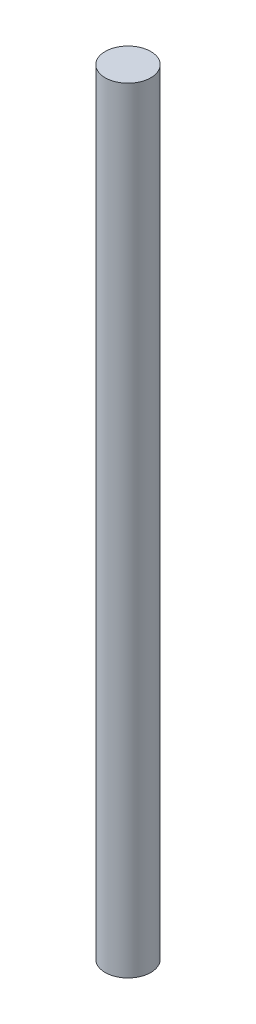
ISO-10303-21;
HEADER;
FILE_DESCRIPTION(('STEP AP214'),'2;1');
FILE_NAME('part.step','',(''),(''),'','','');
FILE_SCHEMA(('AUTOMOTIVE_DESIGN { 1 0 10303 214 1 1 1 1 }'));
ENDSEC;
DATA;
#1=APPLICATION_CONTEXT('core data for automotive mechanical design processes');
#2=APPLICATION_PROTOCOL_DEFINITION('international standard','automotive_design',2000,#1);
#3=PRODUCT_CONTEXT('',#1,'mechanical');
#4=PRODUCT('Part','Part','',(#3));
#5=PRODUCT_RELATED_PRODUCT_CATEGORY('part','',(#4));
#6=PRODUCT_DEFINITION_FORMATION('','',#4);
#7=PRODUCT_DEFINITION_CONTEXT('part definition',#1,'design');
#8=PRODUCT_DEFINITION('design','',#6,#7);
#9=PRODUCT_DEFINITION_SHAPE('','',#8);
#10=(LENGTH_UNIT() NAMED_UNIT(*) SI_UNIT(.MILLI.,.METRE.));
#11=(NAMED_UNIT(*) PLANE_ANGLE_UNIT() SI_UNIT($,.RADIAN.));
#12=(NAMED_UNIT(*) SI_UNIT($,.STERADIAN.) SOLID_ANGLE_UNIT());
#13=UNCERTAINTY_MEASURE_WITH_UNIT(LENGTH_MEASURE(1.E-05),#10,'distance_accuracy_value','');
#14=(GEOMETRIC_REPRESENTATION_CONTEXT(3) GLOBAL_UNCERTAINTY_ASSIGNED_CONTEXT((#13)) GLOBAL_UNIT_ASSIGNED_CONTEXT((#10,
#11,#12)) REPRESENTATION_CONTEXT('',''));
#15=CARTESIAN_POINT('',(0.,0.,0.));
#16=DIRECTION('',(0.,0.,1.));
#17=DIRECTION('',(1.,0.,0.));
#18=AXIS2_PLACEMENT_3D('',#15,#16,#17);
#19=CARTESIAN_POINT('',(0.,170.,0.));
#20=DIRECTION('',(0.,-1.,0.));
#21=DIRECTION('',(0.,0.,-1.));
#22=AXIS2_PLACEMENT_3D('',#19,#20,#21);
#23=CYLINDRICAL_SURFACE('',#22,5.);
#24=CARTESIAN_POINT('',(0.,170.,0.));
#25=DIRECTION('',(0.,1.,0.));
#26=DIRECTION('',(0.,0.,1.));
#27=AXIS2_PLACEMENT_3D('',#24,#25,#26);
#28=CIRCLE('',#27,5.);
#29=CARTESIAN_POINT('',(0.,170.,5.));
#30=VERTEX_POINT('',#29);
#31=EDGE_CURVE('E10',#30,#30,#28,.T.);
#32=ORIENTED_EDGE('',*,*,#31,.F.);
#33=EDGE_LOOP('',(#32));
#34=FACE_BOUND('',#33,.T.);
#35=CARTESIAN_POINT('',(0.,0.,0.));
#36=DIRECTION('',(0.,1.,0.));
#37=DIRECTION('',(0.,0.,1.));
#38=AXIS2_PLACEMENT_3D('',#35,#36,#37);
#39=CIRCLE('',#38,5.);
#40=CARTESIAN_POINT('',(0.,0.,5.));
#41=VERTEX_POINT('',#40);
#42=EDGE_CURVE('E42',#41,#41,#39,.T.);
#43=ORIENTED_EDGE('',*,*,#42,.T.);
#44=EDGE_LOOP('',(#43));
#45=FACE_BOUND('',#44,.T.);
#46=ADVANCED_FACE('F39',(#34,#45),#23,.T.);
#47=CARTESIAN_POINT('',(0.,170.,0.));
#48=DIRECTION('',(0.,1.,0.));
#49=DIRECTION('',(0.,0.,1.));
#50=AXIS2_PLACEMENT_3D('',#47,#48,#49);
#51=PLANE('',#50);
#52=ORIENTED_EDGE('',*,*,#31,.T.);
#53=EDGE_LOOP('',(#52));
#54=FACE_BOUND('',#53,.T.);
#55=ADVANCED_FACE('F56',(#54),#51,.T.);
#56=CARTESIAN_POINT('',(0.,0.,0.));
#57=DIRECTION('',(0.,1.,0.));
#58=DIRECTION('',(0.,0.,1.));
#59=AXIS2_PLACEMENT_3D('',#56,#57,#58);
#60=PLANE('',#59);
#61=ORIENTED_EDGE('',*,*,#42,.F.);
#62=EDGE_LOOP('',(#61));
#63=FACE_BOUND('',#62,.T.);
#64=ADVANCED_FACE('F54',(#63),#60,.F.);
#65=CLOSED_SHELL('',(#46,#55,#64));
#66=MANIFOLD_SOLID_BREP('B2',#65);
#67=ADVANCED_BREP_SHAPE_REPRESENTATION('',(#18,#66),#14);
#68=SHAPE_DEFINITION_REPRESENTATION(#9,#67);
ENDSEC;
END-ISO-10303-21;
